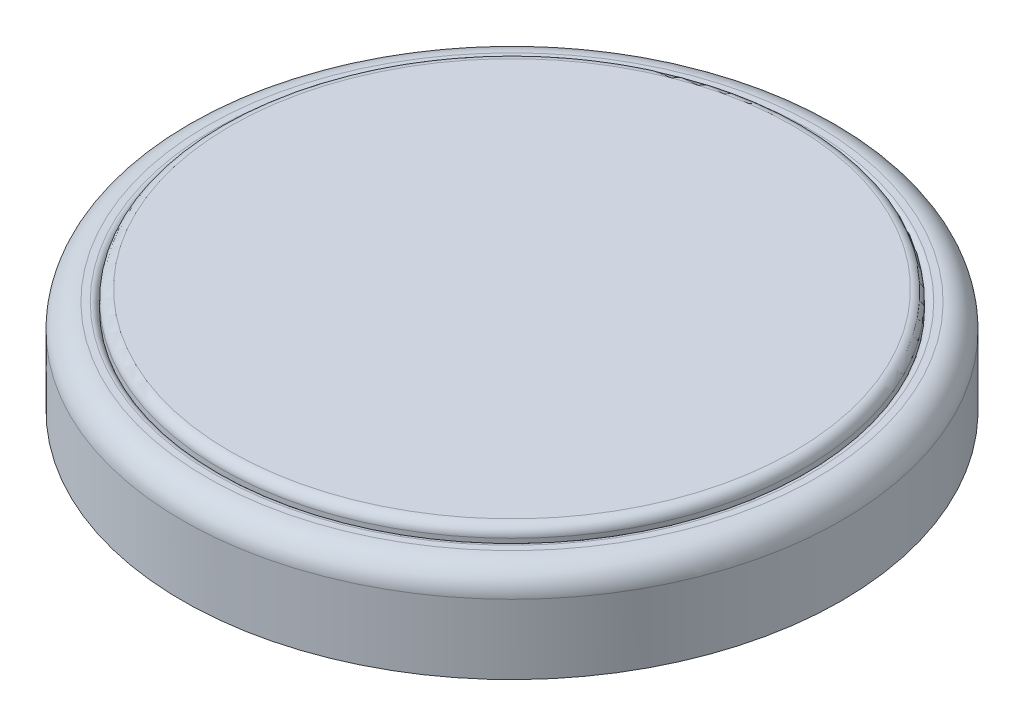
ISO-10303-21;
HEADER;
FILE_DESCRIPTION(('STEP AP214'),'2;1');
FILE_NAME('part.step','',(''),(''),'','','');
FILE_SCHEMA(('AUTOMOTIVE_DESIGN { 1 0 10303 214 1 1 1 1 }'));
ENDSEC;
DATA;
#1=APPLICATION_CONTEXT('core data for automotive mechanical design processes');
#2=APPLICATION_PROTOCOL_DEFINITION('international standard','automotive_design',2000,#1);
#3=PRODUCT_CONTEXT('',#1,'mechanical');
#4=PRODUCT('Part','Part','',(#3));
#5=PRODUCT_RELATED_PRODUCT_CATEGORY('part','',(#4));
#6=PRODUCT_DEFINITION_FORMATION('','',#4);
#7=PRODUCT_DEFINITION_CONTEXT('part definition',#1,'design');
#8=PRODUCT_DEFINITION('design','',#6,#7);
#9=PRODUCT_DEFINITION_SHAPE('','',#8);
#10=(LENGTH_UNIT() NAMED_UNIT(*) SI_UNIT(.MILLI.,.METRE.));
#11=(NAMED_UNIT(*) PLANE_ANGLE_UNIT() SI_UNIT($,.RADIAN.));
#12=(NAMED_UNIT(*) SI_UNIT($,.STERADIAN.) SOLID_ANGLE_UNIT());
#13=UNCERTAINTY_MEASURE_WITH_UNIT(LENGTH_MEASURE(1.E-05),#10,'distance_accuracy_value','');
#14=(GEOMETRIC_REPRESENTATION_CONTEXT(3) GLOBAL_UNCERTAINTY_ASSIGNED_CONTEXT((#13)) GLOBAL_UNIT_ASSIGNED_CONTEXT((#10,
#11,#12)) REPRESENTATION_CONTEXT('',''));
#15=CARTESIAN_POINT('',(0.,0.,0.));
#16=DIRECTION('',(0.,0.,1.));
#17=DIRECTION('',(1.,0.,0.));
#18=AXIS2_PLACEMENT_3D('',#15,#16,#17);
#19=CARTESIAN_POINT('',(0.,2.9,0.));
#20=DIRECTION('',(0.,1.,0.));
#21=DIRECTION('',(0.,0.,1.));
#22=AXIS2_PLACEMENT_3D('',#19,#20,#21);
#23=TOROIDAL_SURFACE('',#22,8.55,0.3);
#24=CARTESIAN_POINT('',(0.,3.2,0.));
#25=DIRECTION('',(0.,-1.,0.));
#26=DIRECTION('',(1.,0.,0.));
#27=AXIS2_PLACEMENT_3D('',#24,#25,#26);
#28=CIRCLE('',#27,8.55);
#29=CARTESIAN_POINT('',(-8.55,3.2,0.));
#30=VERTEX_POINT('',#29);
#31=CARTESIAN_POINT('',(0.,3.2,-8.55));
#32=VERTEX_POINT('',#31);
#33=EDGE_CURVE('E11',#30,#32,#28,.T.);
#34=ORIENTED_EDGE('',*,*,#33,.T.);
#35=CARTESIAN_POINT('',(0.,2.9,-8.55));
#36=DIRECTION('',(-1.,0.,0.));
#37=DIRECTION('',(0.,0.,-1.));
#38=AXIS2_PLACEMENT_3D('',#35,#36,#37);
#39=CIRCLE('',#38,0.3);
#40=CARTESIAN_POINT('',(0.,2.9,-8.85));
#41=VERTEX_POINT('',#40);
#42=EDGE_CURVE('E28',#32,#41,#39,.T.);
#43=ORIENTED_EDGE('',*,*,#42,.T.);
#44=CARTESIAN_POINT('',(0.,2.9,0.));
#45=DIRECTION('',(0.,1.,0.));
#46=DIRECTION('',(1.,0.,0.));
#47=AXIS2_PLACEMENT_3D('',#44,#45,#46);
#48=CIRCLE('',#47,8.85);
#49=CARTESIAN_POINT('',(-8.85,2.9,0.));
#50=VERTEX_POINT('',#49);
#51=EDGE_CURVE('E130',#41,#50,#48,.T.);
#52=ORIENTED_EDGE('',*,*,#51,.T.);
#53=CARTESIAN_POINT('',(0.,2.9,0.));
#54=DIRECTION('',(0.,1.,0.));
#55=DIRECTION('',(1.,0.,0.));
#56=AXIS2_PLACEMENT_3D('',#53,#54,#55);
#57=CIRCLE('',#56,8.85);
#58=EDGE_CURVE('E118',#50,#41,#57,.T.);
#59=ORIENTED_EDGE('',*,*,#58,.T.);
#60=ORIENTED_EDGE('',*,*,#42,.F.);
#61=CARTESIAN_POINT('',(0.,3.2,0.));
#62=DIRECTION('',(0.,-1.,0.));
#63=DIRECTION('',(1.,0.,0.));
#64=AXIS2_PLACEMENT_3D('',#61,#62,#63);
#65=CIRCLE('',#64,8.55);
#66=EDGE_CURVE('E119',#32,#30,#65,.T.);
#67=ORIENTED_EDGE('',*,*,#66,.T.);
#68=EDGE_LOOP('',(#34,#43,#52,#59,#60,#67));
#69=FACE_BOUND('',#68,.T.);
#70=ADVANCED_FACE('F17',(#69),#23,.T.);
#71=CARTESIAN_POINT('',(0.,3.2,0.));
#72=DIRECTION('',(0.,1.,0.));
#73=DIRECTION('',(1.,0.,0.));
#74=AXIS2_PLACEMENT_3D('',#71,#72,#73);
#75=PLANE('',#74);
#76=ORIENTED_EDGE('',*,*,#33,.F.);
#77=ORIENTED_EDGE('',*,*,#66,.F.);
#78=EDGE_LOOP('',(#76,#77));
#79=FACE_BOUND('',#78,.T.);
#80=ADVANCED_FACE('F191',(#79),#75,.T.);
#81=CARTESIAN_POINT('',(0.,0.,0.));
#82=DIRECTION('',(0.,1.,0.));
#83=DIRECTION('',(1.,0.,0.));
#84=AXIS2_PLACEMENT_3D('',#81,#82,#83);
#85=CYLINDRICAL_SURFACE('',#84,8.85);
#86=ORIENTED_EDGE('',*,*,#58,.F.);
#87=DIRECTION('',(0.,-1.,0.));
#88=VECTOR('',#87,1.);
#89=CARTESIAN_POINT('',(-8.85,0.,0.));
#90=LINE('',#89,#88);
#91=CARTESIAN_POINT('',(-8.85,2.66,0.));
#92=VERTEX_POINT('',#91);
#93=EDGE_CURVE('E122',#50,#92,#90,.T.);
#94=ORIENTED_EDGE('',*,*,#93,.T.);
#95=CARTESIAN_POINT('',(0.,2.66,0.));
#96=DIRECTION('',(0.,-1.,0.));
#97=DIRECTION('',(1.,0.,0.));
#98=AXIS2_PLACEMENT_3D('',#95,#96,#97);
#99=CIRCLE('',#98,8.85);
#100=CARTESIAN_POINT('',(0.,2.66,8.85));
#101=VERTEX_POINT('',#100);
#102=EDGE_CURVE('E125',#101,#92,#99,.T.);
#103=ORIENTED_EDGE('',*,*,#102,.F.);
#104=CARTESIAN_POINT('',(0.,2.66,0.));
#105=DIRECTION('',(0.,-1.,0.));
#106=DIRECTION('',(1.,0.,0.));
#107=AXIS2_PLACEMENT_3D('',#104,#105,#106);
#108=CIRCLE('',#107,8.85);
#109=EDGE_CURVE('E123',#92,#101,#108,.T.);
#110=ORIENTED_EDGE('',*,*,#109,.F.);
#111=ORIENTED_EDGE('',*,*,#93,.F.);
#112=ORIENTED_EDGE('',*,*,#51,.F.);
#113=EDGE_LOOP('',(#86,#94,#103,#110,#111,#112));
#114=FACE_BOUND('',#113,.T.);
#115=ADVANCED_FACE('F158',(#114),#85,.T.);
#116=CARTESIAN_POINT('',(0.,2.66,0.));
#117=DIRECTION('',(0.,-1.,0.));
#118=DIRECTION('',(0.,0.,-1.));
#119=AXIS2_PLACEMENT_3D('',#116,#117,#118);
#120=TOROIDAL_SURFACE('',#119,9.05,0.2);
#121=CARTESIAN_POINT('',(0.,2.86,0.));
#122=DIRECTION('',(0.,1.,0.));
#123=DIRECTION('',(1.,0.,0.));
#124=AXIS2_PLACEMENT_3D('',#121,#122,#123);
#125=CIRCLE('',#124,9.05);
#126=CARTESIAN_POINT('',(-9.05,2.86,0.));
#127=VERTEX_POINT('',#126);
#128=CARTESIAN_POINT('',(0.,2.86,9.05));
#129=VERTEX_POINT('',#128);
#130=EDGE_CURVE('E21',#127,#129,#125,.T.);
#131=ORIENTED_EDGE('',*,*,#130,.T.);
#132=CARTESIAN_POINT('',(0.,2.66,9.05));
#133=DIRECTION('',(-1.,0.,0.));
#134=DIRECTION('',(0.,0.,1.));
#135=AXIS2_PLACEMENT_3D('',#132,#133,#134);
#136=CIRCLE('',#135,0.2);
#137=EDGE_CURVE('E141',#129,#101,#136,.T.);
#138=ORIENTED_EDGE('',*,*,#137,.T.);
#139=ORIENTED_EDGE('',*,*,#102,.T.);
#140=ORIENTED_EDGE('',*,*,#109,.T.);
#141=ORIENTED_EDGE('',*,*,#137,.F.);
#142=CARTESIAN_POINT('',(0.,2.86,0.));
#143=DIRECTION('',(0.,1.,0.));
#144=DIRECTION('',(1.,0.,0.));
#145=AXIS2_PLACEMENT_3D('',#142,#143,#144);
#146=CIRCLE('',#145,9.05);
#147=EDGE_CURVE('E96',#129,#127,#146,.T.);
#148=ORIENTED_EDGE('',*,*,#147,.T.);
#149=EDGE_LOOP('',(#131,#138,#139,#140,#141,#148));
#150=FACE_BOUND('',#149,.T.);
#151=ADVANCED_FACE('F152',(#150),#120,.T.);
#152=CARTESIAN_POINT('',(0.,2.86,0.));
#153=DIRECTION('',(0.,1.,0.));
#154=DIRECTION('',(1.,0.,0.));
#155=AXIS2_PLACEMENT_3D('',#152,#153,#154);
#156=PLANE('',#155);
#157=CARTESIAN_POINT('',(0.,2.86,0.));
#158=DIRECTION('',(0.,-1.,0.));
#159=DIRECTION('',(1.,0.,0.));
#160=AXIS2_PLACEMENT_3D('',#157,#158,#159);
#161=CIRCLE('',#160,9.25);
#162=CARTESIAN_POINT('',(-9.25,2.86,0.));
#163=VERTEX_POINT('',#162);
#164=CARTESIAN_POINT('',(0.,2.86,-9.25));
#165=VERTEX_POINT('',#164);
#166=EDGE_CURVE('E101',#163,#165,#161,.T.);
#167=ORIENTED_EDGE('',*,*,#166,.F.);
#168=CARTESIAN_POINT('',(0.,2.86,0.));
#169=DIRECTION('',(0.,-1.,0.));
#170=DIRECTION('',(1.,0.,0.));
#171=AXIS2_PLACEMENT_3D('',#168,#169,#170);
#172=CIRCLE('',#171,9.25);
#173=EDGE_CURVE('E86',#165,#163,#172,.T.);
#174=ORIENTED_EDGE('',*,*,#173,.F.);
#175=EDGE_LOOP('',(#167,#174));
#176=FACE_BOUND('',#175,.T.);
#177=ORIENTED_EDGE('',*,*,#130,.F.);
#178=ORIENTED_EDGE('',*,*,#147,.F.);
#179=EDGE_LOOP('',(#177,#178));
#180=FACE_BOUND('',#179,.T.);
#181=ADVANCED_FACE('F180',(#176,#180),#156,.T.);
#182=CARTESIAN_POINT('',(0.,2.11,0.));
#183=DIRECTION('',(0.,1.,0.));
#184=DIRECTION('',(0.,0.,1.));
#185=AXIS2_PLACEMENT_3D('',#182,#183,#184);
#186=TOROIDAL_SURFACE('',#185,9.25,0.75);
#187=ORIENTED_EDGE('',*,*,#166,.T.);
#188=CARTESIAN_POINT('',(0.,2.11,-9.25));
#189=DIRECTION('',(-1.,0.,0.));
#190=DIRECTION('',(0.,0.,-1.));
#191=AXIS2_PLACEMENT_3D('',#188,#189,#190);
#192=CIRCLE('',#191,0.75);
#193=CARTESIAN_POINT('',(0.,2.11,-10.));
#194=VERTEX_POINT('',#193);
#195=EDGE_CURVE('E98',#165,#194,#192,.T.);
#196=ORIENTED_EDGE('',*,*,#195,.T.);
#197=CARTESIAN_POINT('',(0.,2.11,0.));
#198=DIRECTION('',(0.,1.,0.));
#199=DIRECTION('',(1.,0.,0.));
#200=AXIS2_PLACEMENT_3D('',#197,#198,#199);
#201=CIRCLE('',#200,10.);
#202=CARTESIAN_POINT('',(-10.,2.11,0.));
#203=VERTEX_POINT('',#202);
#204=EDGE_CURVE('E102',#194,#203,#201,.T.);
#205=ORIENTED_EDGE('',*,*,#204,.T.);
#206=CARTESIAN_POINT('',(0.,2.11,0.));
#207=DIRECTION('',(0.,1.,0.));
#208=DIRECTION('',(1.,0.,0.));
#209=AXIS2_PLACEMENT_3D('',#206,#207,#208);
#210=CIRCLE('',#209,10.);
#211=EDGE_CURVE('E83',#203,#194,#210,.T.);
#212=ORIENTED_EDGE('',*,*,#211,.T.);
#213=ORIENTED_EDGE('',*,*,#195,.F.);
#214=ORIENTED_EDGE('',*,*,#173,.T.);
#215=EDGE_LOOP('',(#187,#196,#205,#212,#213,#214));
#216=FACE_BOUND('',#215,.T.);
#217=ADVANCED_FACE('F19',(#216),#186,.T.);
#218=CARTESIAN_POINT('',(0.,0.,0.));
#219=DIRECTION('',(0.,1.,0.));
#220=DIRECTION('',(1.,0.,0.));
#221=AXIS2_PLACEMENT_3D('',#218,#219,#220);
#222=CYLINDRICAL_SURFACE('',#221,10.);
#223=ORIENTED_EDGE('',*,*,#211,.F.);
#224=DIRECTION('',(0.,-1.,0.));
#225=VECTOR('',#224,1.);
#226=CARTESIAN_POINT('',(-10.,0.,0.));
#227=LINE('',#226,#225);
#228=CARTESIAN_POINT('',(-10.,0.,0.));
#229=VERTEX_POINT('',#228);
#230=EDGE_CURVE('E78',#203,#229,#227,.T.);
#231=ORIENTED_EDGE('',*,*,#230,.T.);
#232=CARTESIAN_POINT('',(0.,0.,0.));
#233=DIRECTION('',(0.,1.,0.));
#234=DIRECTION('',(1.,0.,0.));
#235=AXIS2_PLACEMENT_3D('',#232,#233,#234);
#236=CIRCLE('',#235,10.);
#237=EDGE_CURVE('E72',#229,#229,#236,.T.);
#238=ORIENTED_EDGE('',*,*,#237,.T.);
#239=ORIENTED_EDGE('',*,*,#230,.F.);
#240=ORIENTED_EDGE('',*,*,#204,.F.);
#241=EDGE_LOOP('',(#223,#231,#238,#239,#240));
#242=FACE_BOUND('',#241,.T.);
#243=ADVANCED_FACE('F80',(#242),#222,.T.);
#244=CARTESIAN_POINT('',(0.,0.,0.));
#245=DIRECTION('',(0.,1.,0.));
#246=DIRECTION('',(1.,0.,0.));
#247=AXIS2_PLACEMENT_3D('',#244,#245,#246);
#248=PLANE('',#247);
#249=ORIENTED_EDGE('',*,*,#237,.F.);
#250=EDGE_LOOP('',(#249));
#251=FACE_BOUND('',#250,.T.);
#252=ADVANCED_FACE('F74',(#251),#248,.F.);
#253=CLOSED_SHELL('',(#70,#80,#115,#151,#181,#217,#243,#252));
#254=MANIFOLD_SOLID_BREP('B1',#253);
#255=ADVANCED_BREP_SHAPE_REPRESENTATION('',(#18,#254),#14);
#256=SHAPE_DEFINITION_REPRESENTATION(#9,#255);
ENDSEC;
END-ISO-10303-21;
